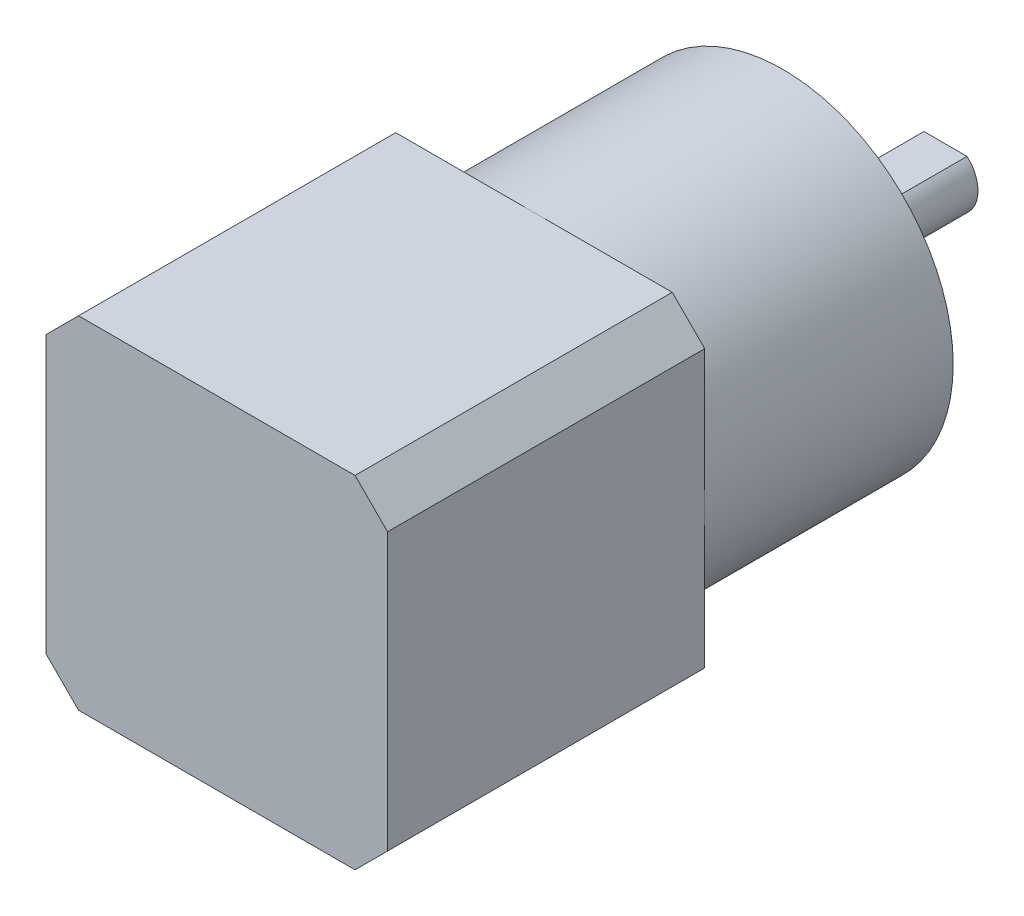
ISO-10303-21;
HEADER;
FILE_DESCRIPTION(('STEP AP214'),'2;1');
FILE_NAME('part.step','',(''),(''),'','','');
FILE_SCHEMA(('AUTOMOTIVE_DESIGN { 1 0 10303 214 1 1 1 1 }'));
ENDSEC;
DATA;
#1=APPLICATION_CONTEXT('core data for automotive mechanical design processes');
#2=APPLICATION_PROTOCOL_DEFINITION('international standard','automotive_design',2000,#1);
#3=PRODUCT_CONTEXT('',#1,'mechanical');
#4=PRODUCT('Part','Part','',(#3));
#5=PRODUCT_RELATED_PRODUCT_CATEGORY('part','',(#4));
#6=PRODUCT_DEFINITION_FORMATION('','',#4);
#7=PRODUCT_DEFINITION_CONTEXT('part definition',#1,'design');
#8=PRODUCT_DEFINITION('design','',#6,#7);
#9=PRODUCT_DEFINITION_SHAPE('','',#8);
#10=(LENGTH_UNIT() NAMED_UNIT(*) SI_UNIT(.MILLI.,.METRE.));
#11=(NAMED_UNIT(*) PLANE_ANGLE_UNIT() SI_UNIT($,.RADIAN.));
#12=(NAMED_UNIT(*) SI_UNIT($,.STERADIAN.) SOLID_ANGLE_UNIT());
#13=UNCERTAINTY_MEASURE_WITH_UNIT(LENGTH_MEASURE(1.E-05),#10,'distance_accuracy_value','');
#14=(GEOMETRIC_REPRESENTATION_CONTEXT(3) GLOBAL_UNCERTAINTY_ASSIGNED_CONTEXT((#13)) GLOBAL_UNIT_ASSIGNED_CONTEXT((#10,
#11,#12)) REPRESENTATION_CONTEXT('',''));
#15=CARTESIAN_POINT('',(0.,0.,0.));
#16=DIRECTION('',(0.,0.,1.));
#17=DIRECTION('',(1.,0.,0.));
#18=AXIS2_PLACEMENT_3D('',#15,#16,#17);
#19=CARTESIAN_POINT('',(21.,21.,39.));
#20=DIRECTION('',(-1.,0.,0.));
#21=DIRECTION('',(0.,-1.,0.));
#22=AXIS2_PLACEMENT_3D('',#19,#20,#21);
#23=PLANE('',#22);
#24=DIRECTION('',(0.,1.,0.));
#25=VECTOR('',#24,1.);
#26=CARTESIAN_POINT('',(21.,21.,39.));
#27=LINE('',#26,#25);
#28=CARTESIAN_POINT('',(21.,-17.,39.));
#29=VERTEX_POINT('',#28);
#30=CARTESIAN_POINT('',(21.,17.,39.));
#31=VERTEX_POINT('',#30);
#32=EDGE_CURVE('E143',#29,#31,#27,.T.);
#33=ORIENTED_EDGE('',*,*,#32,.F.);
#34=DIRECTION('',(0.,0.,-1.));
#35=VECTOR('',#34,1.);
#36=CARTESIAN_POINT('',(21.,-17.,39.));
#37=LINE('',#36,#35);
#38=CARTESIAN_POINT('',(21.,-17.,0.));
#39=VERTEX_POINT('',#38);
#40=EDGE_CURVE('E192',#29,#39,#37,.T.);
#41=ORIENTED_EDGE('',*,*,#40,.T.);
#42=DIRECTION('',(0.,1.,0.));
#43=VECTOR('',#42,1.);
#44=CARTESIAN_POINT('',(21.,21.,0.));
#45=LINE('',#44,#43);
#46=CARTESIAN_POINT('',(21.,17.,0.));
#47=VERTEX_POINT('',#46);
#48=EDGE_CURVE('E140',#39,#47,#45,.T.);
#49=ORIENTED_EDGE('',*,*,#48,.T.);
#50=DIRECTION('',(0.,0.,1.));
#51=VECTOR('',#50,1.);
#52=CARTESIAN_POINT('',(21.,17.,39.));
#53=LINE('',#52,#51);
#54=EDGE_CURVE('E190',#47,#31,#53,.T.);
#55=ORIENTED_EDGE('',*,*,#54,.T.);
#56=EDGE_LOOP('',(#33,#41,#49,#55));
#57=FACE_BOUND('',#56,.T.);
#58=ADVANCED_FACE('F35',(#57),#23,.F.);
#59=CARTESIAN_POINT('',(-21.,21.,39.));
#60=DIRECTION('',(0.,-1.,0.));
#61=DIRECTION('',(0.,0.,-1.));
#62=AXIS2_PLACEMENT_3D('',#59,#60,#61);
#63=PLANE('',#62);
#64=DIRECTION('',(-1.,0.,0.));
#65=VECTOR('',#64,1.);
#66=CARTESIAN_POINT('',(-21.,21.,0.));
#67=LINE('',#66,#65);
#68=CARTESIAN_POINT('',(17.,21.,0.));
#69=VERTEX_POINT('',#68);
#70=CARTESIAN_POINT('',(-17.,21.,0.));
#71=VERTEX_POINT('',#70);
#72=EDGE_CURVE('E158',#69,#71,#67,.T.);
#73=ORIENTED_EDGE('',*,*,#72,.T.);
#74=DIRECTION('',(0.,0.,1.));
#75=VECTOR('',#74,1.);
#76=CARTESIAN_POINT('',(-17.,21.,39.));
#77=LINE('',#76,#75);
#78=CARTESIAN_POINT('',(-17.,21.,39.));
#79=VERTEX_POINT('',#78);
#80=EDGE_CURVE('E40',#71,#79,#77,.T.);
#81=ORIENTED_EDGE('',*,*,#80,.T.);
#82=DIRECTION('',(-1.,0.,0.));
#83=VECTOR('',#82,1.);
#84=CARTESIAN_POINT('',(-21.,21.,39.));
#85=LINE('',#84,#83);
#86=CARTESIAN_POINT('',(17.,21.,39.));
#87=VERTEX_POINT('',#86);
#88=EDGE_CURVE('E146',#87,#79,#85,.T.);
#89=ORIENTED_EDGE('',*,*,#88,.F.);
#90=DIRECTION('',(0.,0.,-1.));
#91=VECTOR('',#90,1.);
#92=CARTESIAN_POINT('',(17.,21.,39.));
#93=LINE('',#92,#91);
#94=EDGE_CURVE('E194',#87,#69,#93,.T.);
#95=ORIENTED_EDGE('',*,*,#94,.T.);
#96=EDGE_LOOP('',(#73,#81,#89,#95));
#97=FACE_BOUND('',#96,.T.);
#98=ADVANCED_FACE('F198',(#97),#63,.F.);
#99=CARTESIAN_POINT('',(-21.,21.,39.));
#100=DIRECTION('',(1.,0.,0.));
#101=DIRECTION('',(0.,1.,0.));
#102=AXIS2_PLACEMENT_3D('',#99,#100,#101);
#103=PLANE('',#102);
#104=DIRECTION('',(0.,-1.,0.));
#105=VECTOR('',#104,1.);
#106=CARTESIAN_POINT('',(-21.,21.,0.));
#107=LINE('',#106,#105);
#108=CARTESIAN_POINT('',(-21.,17.,0.));
#109=VERTEX_POINT('',#108);
#110=CARTESIAN_POINT('',(-21.,-17.,0.));
#111=VERTEX_POINT('',#110);
#112=EDGE_CURVE('E160',#109,#111,#107,.T.);
#113=ORIENTED_EDGE('',*,*,#112,.T.);
#114=DIRECTION('',(0.,0.,1.));
#115=VECTOR('',#114,1.);
#116=CARTESIAN_POINT('',(-21.,-17.,39.));
#117=LINE('',#116,#115);
#118=CARTESIAN_POINT('',(-21.,-17.,39.));
#119=VERTEX_POINT('',#118);
#120=EDGE_CURVE('E180',#111,#119,#117,.T.);
#121=ORIENTED_EDGE('',*,*,#120,.T.);
#122=DIRECTION('',(0.,-1.,0.));
#123=VECTOR('',#122,1.);
#124=CARTESIAN_POINT('',(-21.,21.,39.));
#125=LINE('',#124,#123);
#126=CARTESIAN_POINT('',(-21.,17.,39.));
#127=VERTEX_POINT('',#126);
#128=EDGE_CURVE('E149',#127,#119,#125,.T.);
#129=ORIENTED_EDGE('',*,*,#128,.F.);
#130=DIRECTION('',(0.,0.,-1.));
#131=VECTOR('',#130,1.);
#132=CARTESIAN_POINT('',(-21.,17.,39.));
#133=LINE('',#132,#131);
#134=EDGE_CURVE('E177',#127,#109,#133,.T.);
#135=ORIENTED_EDGE('',*,*,#134,.T.);
#136=EDGE_LOOP('',(#113,#121,#129,#135));
#137=FACE_BOUND('',#136,.T.);
#138=ADVANCED_FACE('F212',(#137),#103,.F.);
#139=CARTESIAN_POINT('',(-21.,-21.,39.));
#140=DIRECTION('',(0.,1.,0.));
#141=DIRECTION('',(0.,0.,1.));
#142=AXIS2_PLACEMENT_3D('',#139,#140,#141);
#143=PLANE('',#142);
#144=DIRECTION('',(1.,0.,0.));
#145=VECTOR('',#144,1.);
#146=CARTESIAN_POINT('',(-21.,-21.,39.));
#147=LINE('',#146,#145);
#148=CARTESIAN_POINT('',(-17.,-21.,39.));
#149=VERTEX_POINT('',#148);
#150=CARTESIAN_POINT('',(17.,-21.,39.));
#151=VERTEX_POINT('',#150);
#152=EDGE_CURVE('E152',#149,#151,#147,.T.);
#153=ORIENTED_EDGE('',*,*,#152,.F.);
#154=DIRECTION('',(0.,0.,-1.));
#155=VECTOR('',#154,1.);
#156=CARTESIAN_POINT('',(-17.,-21.,39.));
#157=LINE('',#156,#155);
#158=CARTESIAN_POINT('',(-17.,-21.,0.));
#159=VERTEX_POINT('',#158);
#160=EDGE_CURVE('E166',#149,#159,#157,.T.);
#161=ORIENTED_EDGE('',*,*,#160,.T.);
#162=DIRECTION('',(1.,0.,0.));
#163=VECTOR('',#162,1.);
#164=CARTESIAN_POINT('',(-21.,-21.,0.));
#165=LINE('',#164,#163);
#166=CARTESIAN_POINT('',(17.,-21.,0.));
#167=VERTEX_POINT('',#166);
#168=EDGE_CURVE('E147',#159,#167,#165,.T.);
#169=ORIENTED_EDGE('',*,*,#168,.T.);
#170=DIRECTION('',(0.,0.,1.));
#171=VECTOR('',#170,1.);
#172=CARTESIAN_POINT('',(17.,-21.,39.));
#173=LINE('',#172,#171);
#174=EDGE_CURVE('E155',#167,#151,#173,.T.);
#175=ORIENTED_EDGE('',*,*,#174,.T.);
#176=EDGE_LOOP('',(#153,#161,#169,#175));
#177=FACE_BOUND('',#176,.T.);
#178=ADVANCED_FACE('F222',(#177),#143,.F.);
#179=CARTESIAN_POINT('',(0.,0.,39.));
#180=DIRECTION('',(0.,0.,1.));
#181=DIRECTION('',(1.,0.,0.));
#182=AXIS2_PLACEMENT_3D('',#179,#180,#181);
#183=PLANE('',#182);
#184=ORIENTED_EDGE('',*,*,#128,.T.);
#185=DIRECTION('',(-0.707106781186546,0.707106781186549,0.));
#186=VECTOR('',#185,1.);
#187=CARTESIAN_POINT('',(-19.,-19.,39.));
#188=LINE('',#187,#186);
#189=EDGE_CURVE('E188',#119,#149,#188,.F.);
#190=ORIENTED_EDGE('',*,*,#189,.T.);
#191=ORIENTED_EDGE('',*,*,#152,.T.);
#192=DIRECTION('',(-0.707106781186549,-0.707106781186546,0.));
#193=VECTOR('',#192,1.);
#194=CARTESIAN_POINT('',(19.,-19.,39.));
#195=LINE('',#194,#193);
#196=EDGE_CURVE('E186',#151,#29,#195,.F.);
#197=ORIENTED_EDGE('',*,*,#196,.T.);
#198=ORIENTED_EDGE('',*,*,#32,.T.);
#199=DIRECTION('',(0.707106781186546,-0.707106781186549,0.));
#200=VECTOR('',#199,1.);
#201=CARTESIAN_POINT('',(19.,19.,39.));
#202=LINE('',#201,#200);
#203=EDGE_CURVE('E182',#31,#87,#202,.F.);
#204=ORIENTED_EDGE('',*,*,#203,.T.);
#205=ORIENTED_EDGE('',*,*,#88,.T.);
#206=DIRECTION('',(0.707106781186549,0.707106781186546,0.));
#207=VECTOR('',#206,1.);
#208=CARTESIAN_POINT('',(-19.,19.,39.));
#209=LINE('',#208,#207);
#210=EDGE_CURVE('E184',#79,#127,#209,.F.);
#211=ORIENTED_EDGE('',*,*,#210,.T.);
#212=EDGE_LOOP('',(#184,#190,#191,#197,#198,#204,#205,#211));
#213=FACE_BOUND('',#212,.T.);
#214=ADVANCED_FACE('F216',(#213),#183,.T.);
#215=CARTESIAN_POINT('',(0.,0.,0.));
#216=DIRECTION('',(0.,0.,1.));
#217=DIRECTION('',(1.,0.,0.));
#218=AXIS2_PLACEMENT_3D('',#215,#216,#217);
#219=PLANE('',#218);
#220=CARTESIAN_POINT('',(0.,0.,0.));
#221=DIRECTION('',(0.,0.,-1.));
#222=DIRECTION('',(-1.,0.,0.));
#223=AXIS2_PLACEMENT_3D('',#220,#221,#222);
#224=CIRCLE('',#223,20.95);
#225=CARTESIAN_POINT('',(-20.95,0.,0.));
#226=VERTEX_POINT('',#225);
#227=EDGE_CURVE('E45',#226,#226,#224,.T.);
#228=ORIENTED_EDGE('',*,*,#227,.F.);
#229=EDGE_LOOP('',(#228));
#230=FACE_BOUND('',#229,.T.);
#231=ORIENTED_EDGE('',*,*,#168,.F.);
#232=DIRECTION('',(0.707106781186546,-0.707106781186549,0.));
#233=VECTOR('',#232,1.);
#234=CARTESIAN_POINT('',(-17.,-21.,0.));
#235=LINE('',#234,#233);
#236=EDGE_CURVE('E175',#159,#111,#235,.F.);
#237=ORIENTED_EDGE('',*,*,#236,.T.);
#238=ORIENTED_EDGE('',*,*,#112,.F.);
#239=DIRECTION('',(-0.707106781186549,-0.707106781186546,0.));
#240=VECTOR('',#239,1.);
#241=CARTESIAN_POINT('',(-21.,17.,0.));
#242=LINE('',#241,#240);
#243=EDGE_CURVE('E171',#109,#71,#242,.F.);
#244=ORIENTED_EDGE('',*,*,#243,.T.);
#245=ORIENTED_EDGE('',*,*,#72,.F.);
#246=DIRECTION('',(-0.707106781186546,0.707106781186549,0.));
#247=VECTOR('',#246,1.);
#248=CARTESIAN_POINT('',(17.,21.,0.));
#249=LINE('',#248,#247);
#250=EDGE_CURVE('E169',#69,#47,#249,.F.);
#251=ORIENTED_EDGE('',*,*,#250,.T.);
#252=ORIENTED_EDGE('',*,*,#48,.F.);
#253=DIRECTION('',(0.707106781186549,0.707106781186546,0.));
#254=VECTOR('',#253,1.);
#255=CARTESIAN_POINT('',(21.,-17.,0.));
#256=LINE('',#255,#254);
#257=EDGE_CURVE('E173',#39,#167,#256,.F.);
#258=ORIENTED_EDGE('',*,*,#257,.T.);
#259=EDGE_LOOP('',(#231,#237,#238,#244,#245,#251,#252,#258));
#260=FACE_BOUND('',#259,.T.);
#261=ADVANCED_FACE('F203',(#230,#260),#219,.F.);
#262=CARTESIAN_POINT('',(-17.,-21.,39.));
#263=DIRECTION('',(0.707106781186549,0.707106781186546,0.));
#264=DIRECTION('',(0.,0.,-1.));
#265=AXIS2_PLACEMENT_3D('',#262,#263,#264);
#266=PLANE('',#265);
#267=ORIENTED_EDGE('',*,*,#189,.F.);
#268=ORIENTED_EDGE('',*,*,#120,.F.);
#269=ORIENTED_EDGE('',*,*,#236,.F.);
#270=ORIENTED_EDGE('',*,*,#160,.F.);
#271=EDGE_LOOP('',(#267,#268,#269,#270));
#272=FACE_BOUND('',#271,.T.);
#273=ADVANCED_FACE('F220',(#272),#266,.F.);
#274=CARTESIAN_POINT('',(21.,-17.,39.));
#275=DIRECTION('',(-0.707106781186546,0.707106781186549,0.));
#276=DIRECTION('',(0.,0.,-1.));
#277=AXIS2_PLACEMENT_3D('',#274,#275,#276);
#278=PLANE('',#277);
#279=ORIENTED_EDGE('',*,*,#196,.F.);
#280=ORIENTED_EDGE('',*,*,#174,.F.);
#281=ORIENTED_EDGE('',*,*,#257,.F.);
#282=ORIENTED_EDGE('',*,*,#40,.F.);
#283=EDGE_LOOP('',(#279,#280,#281,#282));
#284=FACE_BOUND('',#283,.T.);
#285=ADVANCED_FACE('F227',(#284),#278,.F.);
#286=CARTESIAN_POINT('',(-21.,17.,39.));
#287=DIRECTION('',(0.707106781186546,-0.707106781186549,0.));
#288=DIRECTION('',(0.,0.,-1.));
#289=AXIS2_PLACEMENT_3D('',#286,#287,#288);
#290=PLANE('',#289);
#291=ORIENTED_EDGE('',*,*,#210,.F.);
#292=ORIENTED_EDGE('',*,*,#80,.F.);
#293=ORIENTED_EDGE('',*,*,#243,.F.);
#294=ORIENTED_EDGE('',*,*,#134,.F.);
#295=EDGE_LOOP('',(#291,#292,#293,#294));
#296=FACE_BOUND('',#295,.T.);
#297=ADVANCED_FACE('F209',(#296),#290,.F.);
#298=CARTESIAN_POINT('',(17.,21.,39.));
#299=DIRECTION('',(-0.707106781186549,-0.707106781186546,0.));
#300=DIRECTION('',(0.,0.,-1.));
#301=AXIS2_PLACEMENT_3D('',#298,#299,#300);
#302=PLANE('',#301);
#303=ORIENTED_EDGE('',*,*,#203,.F.);
#304=ORIENTED_EDGE('',*,*,#54,.F.);
#305=ORIENTED_EDGE('',*,*,#250,.F.);
#306=ORIENTED_EDGE('',*,*,#94,.F.);
#307=EDGE_LOOP('',(#303,#304,#305,#306));
#308=FACE_BOUND('',#307,.T.);
#309=ADVANCED_FACE('F38',(#308),#302,.F.);
#310=CARTESIAN_POINT('',(0.,0.,-30.6));
#311=DIRECTION('',(0.,0.,1.));
#312=DIRECTION('',(1.,0.,0.));
#313=AXIS2_PLACEMENT_3D('',#310,#311,#312);
#314=CYLINDRICAL_SURFACE('',#313,20.95);
#315=CARTESIAN_POINT('',(0.,0.,-30.6));
#316=DIRECTION('',(0.,0.,-1.));
#317=DIRECTION('',(-1.,0.,0.));
#318=AXIS2_PLACEMENT_3D('',#315,#316,#317);
#319=CIRCLE('',#318,20.95);
#320=CARTESIAN_POINT('',(-20.95,0.,-30.6));
#321=VERTEX_POINT('',#320);
#322=EDGE_CURVE('E136',#321,#321,#319,.T.);
#323=ORIENTED_EDGE('',*,*,#322,.F.);
#324=EDGE_LOOP('',(#323));
#325=FACE_BOUND('',#324,.T.);
#326=ORIENTED_EDGE('',*,*,#227,.T.);
#327=EDGE_LOOP('',(#326));
#328=FACE_BOUND('',#327,.T.);
#329=ADVANCED_FACE('F232',(#325,#328),#314,.T.);
#330=CARTESIAN_POINT('',(0.,0.,-30.6));
#331=DIRECTION('',(0.,0.,-1.));
#332=DIRECTION('',(-1.,0.,0.));
#333=AXIS2_PLACEMENT_3D('',#330,#331,#332);
#334=PLANE('',#333);
#335=CARTESIAN_POINT('',(12.0208152801713,12.0208152801706,-30.6));
#336=DIRECTION('',(0.,0.,-1.));
#337=DIRECTION('',(-1.,0.,0.));
#338=AXIS2_PLACEMENT_3D('',#335,#336,#337);
#339=CIRCLE('',#338,2.0000000000007);
#340=CARTESIAN_POINT('',(10.0208152801706,12.0208152801706,-30.6));
#341=VERTEX_POINT('',#340);
#342=EDGE_CURVE('E459',#341,#341,#339,.T.);
#343=ORIENTED_EDGE('',*,*,#342,.F.);
#344=EDGE_LOOP('',(#343));
#345=FACE_BOUND('',#344,.T.);
#346=CARTESIAN_POINT('',(12.0208152801706,-12.020815280172,-30.6));
#347=DIRECTION('',(0.,0.,-1.));
#348=DIRECTION('',(-1.,0.,0.));
#349=AXIS2_PLACEMENT_3D('',#346,#347,#348);
#350=CIRCLE('',#349,2.00000000000048);
#351=CARTESIAN_POINT('',(10.0208152801702,-12.020815280172,-30.6));
#352=VERTEX_POINT('',#351);
#353=EDGE_CURVE('E458',#352,#352,#350,.T.);
#354=ORIENTED_EDGE('',*,*,#353,.F.);
#355=EDGE_LOOP('',(#354));
#356=FACE_BOUND('',#355,.T.);
#357=CARTESIAN_POINT('',(-12.020815280172,-12.0208152801713,-30.6));
#358=DIRECTION('',(0.,0.,-1.));
#359=DIRECTION('',(-1.,0.,0.));
#360=AXIS2_PLACEMENT_3D('',#357,#358,#359);
#361=CIRCLE('',#360,1.99999999999982);
#362=CARTESIAN_POINT('',(-14.0208152801718,-12.0208152801713,-30.6));
#363=VERTEX_POINT('',#362);
#364=EDGE_CURVE('E477',#363,#363,#361,.T.);
#365=ORIENTED_EDGE('',*,*,#364,.F.);
#366=EDGE_LOOP('',(#365));
#367=FACE_BOUND('',#366,.T.);
#368=CARTESIAN_POINT('',(-12.0208152801713,12.0208152801713,-30.6));
#369=DIRECTION('',(0.,0.,-1.));
#370=DIRECTION('',(-1.,0.,0.));
#371=AXIS2_PLACEMENT_3D('',#368,#369,#370);
#372=CIRCLE('',#371,2.);
#373=CARTESIAN_POINT('',(-14.0208152801713,12.0208152801713,-30.6));
#374=VERTEX_POINT('',#373);
#375=EDGE_CURVE('E471',#374,#374,#372,.T.);
#376=ORIENTED_EDGE('',*,*,#375,.F.);
#377=EDGE_LOOP('',(#376));
#378=FACE_BOUND('',#377,.T.);
#379=CARTESIAN_POINT('',(0.,0.,-30.6));
#380=DIRECTION('',(0.,0.,-1.));
#381=DIRECTION('',(-1.,0.,0.));
#382=AXIS2_PLACEMENT_3D('',#379,#380,#381);
#383=CIRCLE('',#382,4.);
#384=CARTESIAN_POINT('',(-4.,0.,-30.6));
#385=VERTEX_POINT('',#384);
#386=EDGE_CURVE('E11',#385,#385,#383,.T.);
#387=ORIENTED_EDGE('',*,*,#386,.F.);
#388=EDGE_LOOP('',(#387));
#389=FACE_BOUND('',#388,.T.);
#390=ORIENTED_EDGE('',*,*,#322,.T.);
#391=EDGE_LOOP('',(#390));
#392=FACE_BOUND('',#391,.T.);
#393=ADVANCED_FACE('F237',(#345,#356,#367,#378,#389,#392),#334,.T.);
#394=CARTESIAN_POINT('',(0.,0.,-50.6));
#395=DIRECTION('',(0.,0.,1.));
#396=DIRECTION('',(1.,0.,0.));
#397=AXIS2_PLACEMENT_3D('',#394,#395,#396);
#398=CYLINDRICAL_SURFACE('',#397,4.);
#399=CARTESIAN_POINT('',(0.,0.,-50.6));
#400=DIRECTION('',(0.,0.,-1.));
#401=DIRECTION('',(-1.,0.,0.));
#402=AXIS2_PLACEMENT_3D('',#399,#400,#401);
#403=CIRCLE('',#402,4.);
#404=CARTESIAN_POINT('',(2.64575131106459,3.,-50.6));
#405=VERTEX_POINT('',#404);
#406=CARTESIAN_POINT('',(-2.64575131106459,3.,-50.6));
#407=VERTEX_POINT('',#406);
#408=EDGE_CURVE('E131',#405,#407,#403,.T.);
#409=ORIENTED_EDGE('',*,*,#408,.F.);
#410=DIRECTION('',(0.,0.,-1.));
#411=VECTOR('',#410,1.);
#412=CARTESIAN_POINT('',(2.64575131106459,3.,-35.6));
#413=LINE('',#412,#411);
#414=CARTESIAN_POINT('',(2.64575131106459,3.,-35.6));
#415=VERTEX_POINT('',#414);
#416=EDGE_CURVE('E53',#415,#405,#413,.T.);
#417=ORIENTED_EDGE('',*,*,#416,.F.);
#418=CARTESIAN_POINT('',(0.,0.,-35.6));
#419=DIRECTION('',(0.,0.,-1.));
#420=DIRECTION('',(-1.,0.,0.));
#421=AXIS2_PLACEMENT_3D('',#418,#419,#420);
#422=CIRCLE('',#421,4.);
#423=CARTESIAN_POINT('',(-2.64575131106459,3.,-35.6));
#424=VERTEX_POINT('',#423);
#425=EDGE_CURVE('E117',#424,#415,#422,.T.);
#426=ORIENTED_EDGE('',*,*,#425,.F.);
#427=DIRECTION('',(0.,0.,-1.));
#428=VECTOR('',#427,1.);
#429=CARTESIAN_POINT('',(-2.64575131106459,3.,-35.6));
#430=LINE('',#429,#428);
#431=EDGE_CURVE('E125',#424,#407,#430,.T.);
#432=ORIENTED_EDGE('',*,*,#431,.T.);
#433=EDGE_LOOP('',(#409,#417,#426,#432));
#434=FACE_BOUND('',#433,.T.);
#435=ORIENTED_EDGE('',*,*,#386,.T.);
#436=EDGE_LOOP('',(#435));
#437=FACE_BOUND('',#436,.T.);
#438=ADVANCED_FACE('F128',(#434,#437),#398,.T.);
#439=CARTESIAN_POINT('',(0.,0.,-50.6));
#440=DIRECTION('',(0.,0.,-1.));
#441=DIRECTION('',(-1.,0.,0.));
#442=AXIS2_PLACEMENT_3D('',#439,#440,#441);
#443=PLANE('',#442);
#444=DIRECTION('',(-1.,0.,0.));
#445=VECTOR('',#444,1.);
#446=CARTESIAN_POINT('',(2.64575131106459,3.,-50.6));
#447=LINE('',#446,#445);
#448=EDGE_CURVE('E122',#405,#407,#447,.T.);
#449=ORIENTED_EDGE('',*,*,#448,.F.);
#450=ORIENTED_EDGE('',*,*,#408,.T.);
#451=EDGE_LOOP('',(#449,#450));
#452=FACE_BOUND('',#451,.T.);
#453=ADVANCED_FACE('F303',(#452),#443,.T.);
#454=CARTESIAN_POINT('',(2.64575131106459,3.,-35.6));
#455=DIRECTION('',(0.,-1.,0.));
#456=DIRECTION('',(1.,0.,0.));
#457=AXIS2_PLACEMENT_3D('',#454,#455,#456);
#458=PLANE('',#457);
#459=ORIENTED_EDGE('',*,*,#448,.T.);
#460=ORIENTED_EDGE('',*,*,#431,.F.);
#461=DIRECTION('',(-1.,0.,0.));
#462=VECTOR('',#461,1.);
#463=CARTESIAN_POINT('',(2.64575131106459,3.,-35.6));
#464=LINE('',#463,#462);
#465=EDGE_CURVE('E119',#415,#424,#464,.T.);
#466=ORIENTED_EDGE('',*,*,#465,.F.);
#467=ORIENTED_EDGE('',*,*,#416,.T.);
#468=EDGE_LOOP('',(#459,#460,#466,#467));
#469=FACE_BOUND('',#468,.T.);
#470=ADVANCED_FACE('F124',(#469),#458,.F.);
#471=CARTESIAN_POINT('',(0.,0.,-35.6));
#472=DIRECTION('',(0.,0.,-1.));
#473=DIRECTION('',(-1.,0.,0.));
#474=AXIS2_PLACEMENT_3D('',#471,#472,#473);
#475=PLANE('',#474);
#476=ORIENTED_EDGE('',*,*,#425,.T.);
#477=ORIENTED_EDGE('',*,*,#465,.T.);
#478=EDGE_LOOP('',(#476,#477));
#479=FACE_BOUND('',#478,.T.);
#480=ADVANCED_FACE('F118',(#479),#475,.T.);
#481=CARTESIAN_POINT('',(-12.0208152801713,12.0208152801713,-10.6));
#482=DIRECTION('',(0.,0.,-1.));
#483=DIRECTION('',(-1.,0.,0.));
#484=AXIS2_PLACEMENT_3D('',#481,#482,#483);
#485=CYLINDRICAL_SURFACE('',#484,2.);
#486=CARTESIAN_POINT('',(-12.0208152801713,12.0208152801713,-10.6));
#487=DIRECTION('',(0.,0.,-1.));
#488=DIRECTION('',(-1.,0.,0.));
#489=AXIS2_PLACEMENT_3D('',#486,#487,#488);
#490=CIRCLE('',#489,2.);
#491=CARTESIAN_POINT('',(-14.0208152801713,12.0208152801713,-10.6));
#492=VERTEX_POINT('',#491);
#493=EDGE_CURVE('E468',#492,#492,#490,.T.);
#494=ORIENTED_EDGE('',*,*,#493,.F.);
#495=EDGE_LOOP('',(#494));
#496=FACE_BOUND('',#495,.T.);
#497=ORIENTED_EDGE('',*,*,#375,.T.);
#498=EDGE_LOOP('',(#497));
#499=FACE_BOUND('',#498,.T.);
#500=ADVANCED_FACE('F329',(#496,#499),#485,.F.);
#501=CARTESIAN_POINT('',(-12.0208152801713,12.0208152801713,-10.6));
#502=DIRECTION('',(0.,0.,-1.));
#503=DIRECTION('',(-1.,0.,0.));
#504=AXIS2_PLACEMENT_3D('',#501,#502,#503);
#505=PLANE('',#504);
#506=ORIENTED_EDGE('',*,*,#493,.T.);
#507=EDGE_LOOP('',(#506));
#508=FACE_BOUND('',#507,.T.);
#509=ADVANCED_FACE('F345',(#508),#505,.T.);
#510=CARTESIAN_POINT('',(-12.020815280172,-12.0208152801713,-10.6));
#511=DIRECTION('',(0.,0.,-1.));
#512=DIRECTION('',(-1.,0.,0.));
#513=AXIS2_PLACEMENT_3D('',#510,#511,#512);
#514=CYLINDRICAL_SURFACE('',#513,1.99999999999982);
#515=CARTESIAN_POINT('',(-12.020815280172,-12.0208152801713,-10.6));
#516=DIRECTION('',(0.,0.,-1.));
#517=DIRECTION('',(-1.,0.,0.));
#518=AXIS2_PLACEMENT_3D('',#515,#516,#517);
#519=CIRCLE('',#518,1.99999999999982);
#520=CARTESIAN_POINT('',(-14.0208152801718,-12.0208152801713,-10.6));
#521=VERTEX_POINT('',#520);
#522=EDGE_CURVE('E473',#521,#521,#519,.T.);
#523=ORIENTED_EDGE('',*,*,#522,.F.);
#524=EDGE_LOOP('',(#523));
#525=FACE_BOUND('',#524,.T.);
#526=ORIENTED_EDGE('',*,*,#364,.T.);
#527=EDGE_LOOP('',(#526));
#528=FACE_BOUND('',#527,.T.);
#529=ADVANCED_FACE('F355',(#525,#528),#514,.F.);
#530=CARTESIAN_POINT('',(-12.020815280172,-12.0208152801713,-10.6));
#531=DIRECTION('',(0.,0.,-1.));
#532=DIRECTION('',(-1.,0.,0.));
#533=AXIS2_PLACEMENT_3D('',#530,#531,#532);
#534=PLANE('',#533);
#535=ORIENTED_EDGE('',*,*,#522,.T.);
#536=EDGE_LOOP('',(#535));
#537=FACE_BOUND('',#536,.T.);
#538=ADVANCED_FACE('F365',(#537),#534,.T.);
#539=CARTESIAN_POINT('',(12.0208152801706,-12.020815280172,-10.6));
#540=DIRECTION('',(0.,0.,-1.));
#541=DIRECTION('',(-1.,0.,0.));
#542=AXIS2_PLACEMENT_3D('',#539,#540,#541);
#543=CYLINDRICAL_SURFACE('',#542,2.00000000000048);
#544=CARTESIAN_POINT('',(12.0208152801706,-12.020815280172,-10.6));
#545=DIRECTION('',(0.,0.,-1.));
#546=DIRECTION('',(-1.,0.,0.));
#547=AXIS2_PLACEMENT_3D('',#544,#545,#546);
#548=CIRCLE('',#547,2.00000000000048);
#549=CARTESIAN_POINT('',(10.0208152801702,-12.020815280172,-10.6));
#550=VERTEX_POINT('',#549);
#551=EDGE_CURVE('E462',#550,#550,#548,.T.);
#552=ORIENTED_EDGE('',*,*,#551,.F.);
#553=EDGE_LOOP('',(#552));
#554=FACE_BOUND('',#553,.T.);
#555=ORIENTED_EDGE('',*,*,#353,.T.);
#556=EDGE_LOOP('',(#555));
#557=FACE_BOUND('',#556,.T.);
#558=ADVANCED_FACE('F375',(#554,#557),#543,.F.);
#559=CARTESIAN_POINT('',(12.0208152801706,-12.020815280172,-10.6));
#560=DIRECTION('',(0.,0.,-1.));
#561=DIRECTION('',(-1.,0.,0.));
#562=AXIS2_PLACEMENT_3D('',#559,#560,#561);
#563=PLANE('',#562);
#564=ORIENTED_EDGE('',*,*,#551,.T.);
#565=EDGE_LOOP('',(#564));
#566=FACE_BOUND('',#565,.T.);
#567=ADVANCED_FACE('F385',(#566),#563,.T.);
#568=CARTESIAN_POINT('',(12.0208152801713,12.0208152801706,-10.6));
#569=DIRECTION('',(0.,0.,-1.));
#570=DIRECTION('',(-1.,0.,0.));
#571=AXIS2_PLACEMENT_3D('',#568,#569,#570);
#572=CYLINDRICAL_SURFACE('',#571,2.0000000000007);
#573=CARTESIAN_POINT('',(12.0208152801713,12.0208152801706,-10.6));
#574=DIRECTION('',(0.,0.,-1.));
#575=DIRECTION('',(-1.,0.,0.));
#576=AXIS2_PLACEMENT_3D('',#573,#574,#575);
#577=CIRCLE('',#576,2.0000000000007);
#578=CARTESIAN_POINT('',(10.0208152801706,12.0208152801706,-10.6));
#579=VERTEX_POINT('',#578);
#580=EDGE_CURVE('E457',#579,#579,#577,.T.);
#581=ORIENTED_EDGE('',*,*,#580,.F.);
#582=EDGE_LOOP('',(#581));
#583=FACE_BOUND('',#582,.T.);
#584=ORIENTED_EDGE('',*,*,#342,.T.);
#585=EDGE_LOOP('',(#584));
#586=FACE_BOUND('',#585,.T.);
#587=ADVANCED_FACE('F395',(#583,#586),#572,.F.);
#588=CARTESIAN_POINT('',(12.0208152801713,12.0208152801706,-10.6));
#589=DIRECTION('',(0.,0.,-1.));
#590=DIRECTION('',(-1.,0.,0.));
#591=AXIS2_PLACEMENT_3D('',#588,#589,#590);
#592=PLANE('',#591);
#593=ORIENTED_EDGE('',*,*,#580,.T.);
#594=EDGE_LOOP('',(#593));
#595=FACE_BOUND('',#594,.T.);
#596=ADVANCED_FACE('F405',(#595),#592,.T.);
#597=CLOSED_SHELL('',(#58,#98,#138,#178,#214,#261,#273,#285,#297,#309,#329,#393,#438,#453,#470,
#480,#500,#509,#529,#538,#558,#567,#587,#596));
#598=MANIFOLD_SOLID_BREP('B2',#597);
#599=ADVANCED_BREP_SHAPE_REPRESENTATION('',(#18,#598),#14);
#600=SHAPE_DEFINITION_REPRESENTATION(#9,#599);
ENDSEC;
END-ISO-10303-21;
